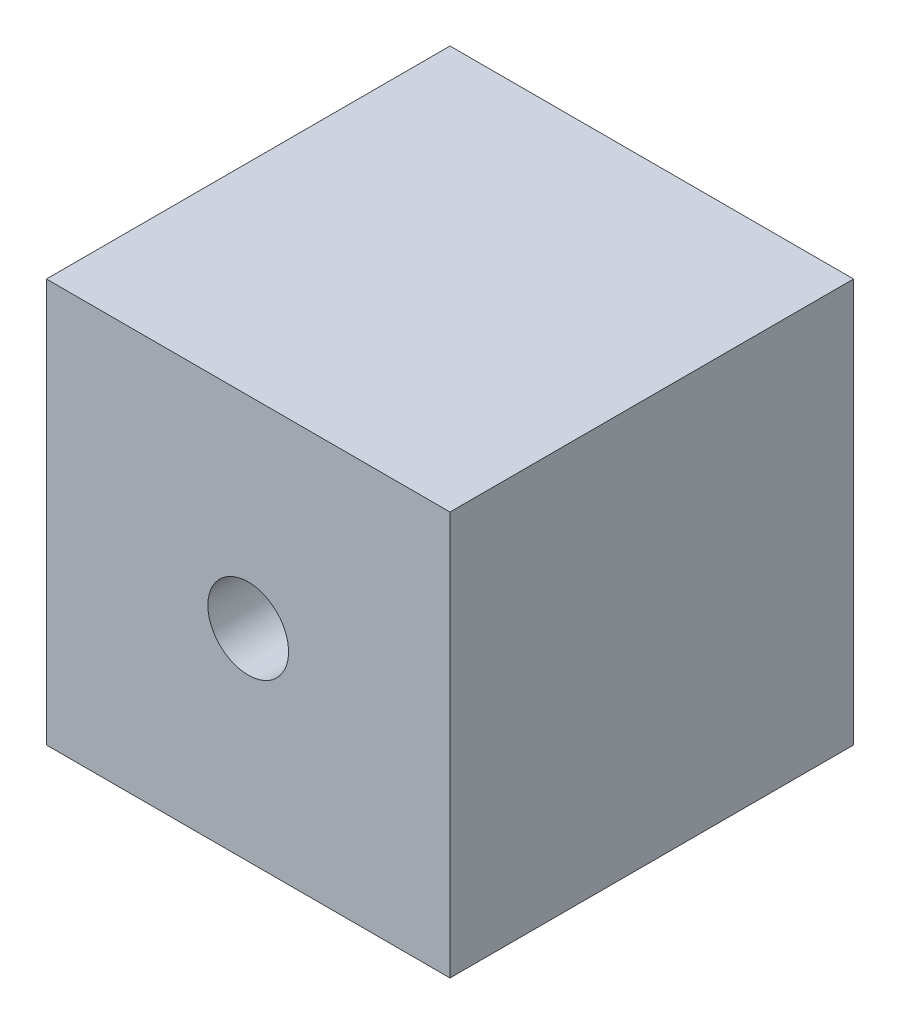
ISO-10303-21;
HEADER;
FILE_DESCRIPTION(('STEP AP214'),'2;1');
FILE_NAME('part.step','',(''),(''),'','','');
FILE_SCHEMA(('AUTOMOTIVE_DESIGN { 1 0 10303 214 1 1 1 1 }'));
ENDSEC;
DATA;
#1=APPLICATION_CONTEXT('core data for automotive mechanical design processes');
#2=APPLICATION_PROTOCOL_DEFINITION('international standard','automotive_design',2000,#1);
#3=PRODUCT_CONTEXT('',#1,'mechanical');
#4=PRODUCT('Part','Part','',(#3));
#5=PRODUCT_RELATED_PRODUCT_CATEGORY('part','',(#4));
#6=PRODUCT_DEFINITION_FORMATION('','',#4);
#7=PRODUCT_DEFINITION_CONTEXT('part definition',#1,'design');
#8=PRODUCT_DEFINITION('design','',#6,#7);
#9=PRODUCT_DEFINITION_SHAPE('','',#8);
#10=(LENGTH_UNIT() NAMED_UNIT(*) SI_UNIT(.MILLI.,.METRE.));
#11=(NAMED_UNIT(*) PLANE_ANGLE_UNIT() SI_UNIT($,.RADIAN.));
#12=(NAMED_UNIT(*) SI_UNIT($,.STERADIAN.) SOLID_ANGLE_UNIT());
#13=UNCERTAINTY_MEASURE_WITH_UNIT(LENGTH_MEASURE(1.E-05),#10,'distance_accuracy_value','');
#14=(GEOMETRIC_REPRESENTATION_CONTEXT(3) GLOBAL_UNCERTAINTY_ASSIGNED_CONTEXT((#13)) GLOBAL_UNIT_ASSIGNED_CONTEXT((#10,
#11,#12)) REPRESENTATION_CONTEXT('',''));
#15=CARTESIAN_POINT('',(0.,0.,0.));
#16=DIRECTION('',(0.,0.,1.));
#17=DIRECTION('',(1.,0.,0.));
#18=AXIS2_PLACEMENT_3D('',#15,#16,#17);
#19=CARTESIAN_POINT('',(-10.,-10.,10.));
#20=DIRECTION('',(1.,0.,0.));
#21=DIRECTION('',(0.,0.,-1.));
#22=AXIS2_PLACEMENT_3D('',#19,#20,#21);
#23=PLANE('',#22);
#24=DIRECTION('',(0.,-1.,0.));
#25=VECTOR('',#24,1.);
#26=CARTESIAN_POINT('',(-10.,-10.,-10.));
#27=LINE('',#26,#25);
#28=CARTESIAN_POINT('',(-10.,10.,-10.));
#29=VERTEX_POINT('',#28);
#30=CARTESIAN_POINT('',(-10.,-10.,-10.));
#31=VERTEX_POINT('',#30);
#32=EDGE_CURVE('E101',#29,#31,#27,.T.);
#33=ORIENTED_EDGE('',*,*,#32,.T.);
#34=DIRECTION('',(0.,0.,-1.));
#35=VECTOR('',#34,1.);
#36=CARTESIAN_POINT('',(-10.,-10.,10.));
#37=LINE('',#36,#35);
#38=CARTESIAN_POINT('',(-10.,-10.,10.));
#39=VERTEX_POINT('',#38);
#40=EDGE_CURVE('E11',#39,#31,#37,.T.);
#41=ORIENTED_EDGE('',*,*,#40,.F.);
#42=DIRECTION('',(0.,-1.,0.));
#43=VECTOR('',#42,1.);
#44=CARTESIAN_POINT('',(-10.,-10.,10.));
#45=LINE('',#44,#43);
#46=CARTESIAN_POINT('',(-10.,10.,10.));
#47=VERTEX_POINT('',#46);
#48=EDGE_CURVE('E91',#47,#39,#45,.T.);
#49=ORIENTED_EDGE('',*,*,#48,.F.);
#50=DIRECTION('',(0.,0.,-1.));
#51=VECTOR('',#50,1.);
#52=CARTESIAN_POINT('',(-10.,10.,10.));
#53=LINE('',#52,#51);
#54=EDGE_CURVE('E99',#47,#29,#53,.T.);
#55=ORIENTED_EDGE('',*,*,#54,.T.);
#56=EDGE_LOOP('',(#33,#41,#49,#55));
#57=FACE_BOUND('',#56,.T.);
#58=ADVANCED_FACE('F39',(#57),#23,.F.);
#59=CARTESIAN_POINT('',(-10.,-10.,10.));
#60=DIRECTION('',(0.,1.,0.));
#61=DIRECTION('',(0.,0.,1.));
#62=AXIS2_PLACEMENT_3D('',#59,#60,#61);
#63=PLANE('',#62);
#64=DIRECTION('',(1.,0.,0.));
#65=VECTOR('',#64,1.);
#66=CARTESIAN_POINT('',(-10.,-10.,-10.));
#67=LINE('',#66,#65);
#68=CARTESIAN_POINT('',(10.,-10.,-10.));
#69=VERTEX_POINT('',#68);
#70=EDGE_CURVE('E94',#31,#69,#67,.T.);
#71=ORIENTED_EDGE('',*,*,#70,.T.);
#72=DIRECTION('',(0.,0.,-1.));
#73=VECTOR('',#72,1.);
#74=CARTESIAN_POINT('',(10.,-10.,10.));
#75=LINE('',#74,#73);
#76=CARTESIAN_POINT('',(10.,-10.,10.));
#77=VERTEX_POINT('',#76);
#78=EDGE_CURVE('E48',#77,#69,#75,.T.);
#79=ORIENTED_EDGE('',*,*,#78,.F.);
#80=DIRECTION('',(1.,0.,0.));
#81=VECTOR('',#80,1.);
#82=CARTESIAN_POINT('',(-10.,-10.,10.));
#83=LINE('',#82,#81);
#84=EDGE_CURVE('E86',#39,#77,#83,.T.);
#85=ORIENTED_EDGE('',*,*,#84,.F.);
#86=ORIENTED_EDGE('',*,*,#40,.T.);
#87=EDGE_LOOP('',(#71,#79,#85,#86));
#88=FACE_BOUND('',#87,.T.);
#89=ADVANCED_FACE('F92',(#88),#63,.F.);
#90=CARTESIAN_POINT('',(10.,-10.,10.));
#91=DIRECTION('',(-1.,0.,0.));
#92=DIRECTION('',(0.,0.,1.));
#93=AXIS2_PLACEMENT_3D('',#90,#91,#92);
#94=PLANE('',#93);
#95=DIRECTION('',(0.,1.,0.));
#96=VECTOR('',#95,1.);
#97=CARTESIAN_POINT('',(10.,-10.,-10.));
#98=LINE('',#97,#96);
#99=CARTESIAN_POINT('',(10.,10.,-10.));
#100=VERTEX_POINT('',#99);
#101=EDGE_CURVE('E71',#69,#100,#98,.T.);
#102=ORIENTED_EDGE('',*,*,#101,.T.);
#103=DIRECTION('',(0.,0.,-1.));
#104=VECTOR('',#103,1.);
#105=CARTESIAN_POINT('',(10.,10.,10.));
#106=LINE('',#105,#104);
#107=CARTESIAN_POINT('',(10.,10.,10.));
#108=VERTEX_POINT('',#107);
#109=EDGE_CURVE('E96',#108,#100,#106,.T.);
#110=ORIENTED_EDGE('',*,*,#109,.F.);
#111=DIRECTION('',(0.,1.,0.));
#112=VECTOR('',#111,1.);
#113=CARTESIAN_POINT('',(10.,-10.,10.));
#114=LINE('',#113,#112);
#115=EDGE_CURVE('E87',#77,#108,#114,.T.);
#116=ORIENTED_EDGE('',*,*,#115,.F.);
#117=ORIENTED_EDGE('',*,*,#78,.T.);
#118=EDGE_LOOP('',(#102,#110,#116,#117));
#119=FACE_BOUND('',#118,.T.);
#120=ADVANCED_FACE('F97',(#119),#94,.F.);
#121=CARTESIAN_POINT('',(-10.,10.,10.));
#122=DIRECTION('',(0.,-1.,0.));
#123=DIRECTION('',(0.,0.,-1.));
#124=AXIS2_PLACEMENT_3D('',#121,#122,#123);
#125=PLANE('',#124);
#126=DIRECTION('',(-1.,0.,0.));
#127=VECTOR('',#126,1.);
#128=CARTESIAN_POINT('',(-10.,10.,-10.));
#129=LINE('',#128,#127);
#130=EDGE_CURVE('E80',#100,#29,#129,.T.);
#131=ORIENTED_EDGE('',*,*,#130,.T.);
#132=ORIENTED_EDGE('',*,*,#54,.F.);
#133=DIRECTION('',(-1.,0.,0.));
#134=VECTOR('',#133,1.);
#135=CARTESIAN_POINT('',(-10.,10.,10.));
#136=LINE('',#135,#134);
#137=EDGE_CURVE('E57',#108,#47,#136,.T.);
#138=ORIENTED_EDGE('',*,*,#137,.F.);
#139=ORIENTED_EDGE('',*,*,#109,.T.);
#140=EDGE_LOOP('',(#131,#132,#138,#139));
#141=FACE_BOUND('',#140,.T.);
#142=ADVANCED_FACE('F115',(#141),#125,.F.);
#143=CARTESIAN_POINT('',(0.,0.,10.));
#144=DIRECTION('',(0.,0.,-1.));
#145=DIRECTION('',(-1.,0.,0.));
#146=AXIS2_PLACEMENT_3D('',#143,#144,#145);
#147=PLANE('',#146);
#148=CARTESIAN_POINT('',(0.,0.,10.));
#149=DIRECTION('',(0.,0.,-1.));
#150=DIRECTION('',(-1.,0.,0.));
#151=AXIS2_PLACEMENT_3D('',#148,#149,#150);
#152=CIRCLE('',#151,2.);
#153=CARTESIAN_POINT('',(-2.,0.,10.));
#154=VERTEX_POINT('',#153);
#155=EDGE_CURVE('E110',#154,#154,#152,.F.);
#156=ORIENTED_EDGE('',*,*,#155,.F.);
#157=EDGE_LOOP('',(#156));
#158=FACE_BOUND('',#157,.T.);
#159=ORIENTED_EDGE('',*,*,#48,.T.);
#160=ORIENTED_EDGE('',*,*,#84,.T.);
#161=ORIENTED_EDGE('',*,*,#115,.T.);
#162=ORIENTED_EDGE('',*,*,#137,.T.);
#163=EDGE_LOOP('',(#159,#160,#161,#162));
#164=FACE_BOUND('',#163,.T.);
#165=ADVANCED_FACE('F90',(#158,#164),#147,.F.);
#166=CARTESIAN_POINT('',(0.,0.,-10.));
#167=DIRECTION('',(0.,0.,-1.));
#168=DIRECTION('',(-1.,0.,0.));
#169=AXIS2_PLACEMENT_3D('',#166,#167,#168);
#170=PLANE('',#169);
#171=CARTESIAN_POINT('',(0.,0.,-10.));
#172=DIRECTION('',(0.,0.,-1.));
#173=DIRECTION('',(-1.,0.,0.));
#174=AXIS2_PLACEMENT_3D('',#171,#172,#173);
#175=CIRCLE('',#174,2.);
#176=CARTESIAN_POINT('',(-2.,0.,-10.));
#177=VERTEX_POINT('',#176);
#178=EDGE_CURVE('E45',#177,#177,#175,.F.);
#179=ORIENTED_EDGE('',*,*,#178,.T.);
#180=EDGE_LOOP('',(#179));
#181=FACE_BOUND('',#180,.T.);
#182=ORIENTED_EDGE('',*,*,#32,.F.);
#183=ORIENTED_EDGE('',*,*,#130,.F.);
#184=ORIENTED_EDGE('',*,*,#101,.F.);
#185=ORIENTED_EDGE('',*,*,#70,.F.);
#186=EDGE_LOOP('',(#182,#183,#184,#185));
#187=FACE_BOUND('',#186,.T.);
#188=ADVANCED_FACE('F113',(#181,#187),#170,.T.);
#189=CARTESIAN_POINT('',(0.,0.,12.));
#190=DIRECTION('',(0.,0.,-1.));
#191=DIRECTION('',(-1.,0.,0.));
#192=AXIS2_PLACEMENT_3D('',#189,#190,#191);
#193=CYLINDRICAL_SURFACE('',#192,2.);
#194=ORIENTED_EDGE('',*,*,#178,.F.);
#195=EDGE_LOOP('',(#194));
#196=FACE_BOUND('',#195,.T.);
#197=ORIENTED_EDGE('',*,*,#155,.T.);
#198=EDGE_LOOP('',(#197));
#199=FACE_BOUND('',#198,.T.);
#200=ADVANCED_FACE('F124',(#196,#199),#193,.F.);
#201=CLOSED_SHELL('',(#58,#89,#120,#142,#165,#188,#200));
#202=MANIFOLD_SOLID_BREP('B2',#201);
#203=ADVANCED_BREP_SHAPE_REPRESENTATION('',(#18,#202),#14);
#204=SHAPE_DEFINITION_REPRESENTATION(#9,#203);
ENDSEC;
END-ISO-10303-21;
